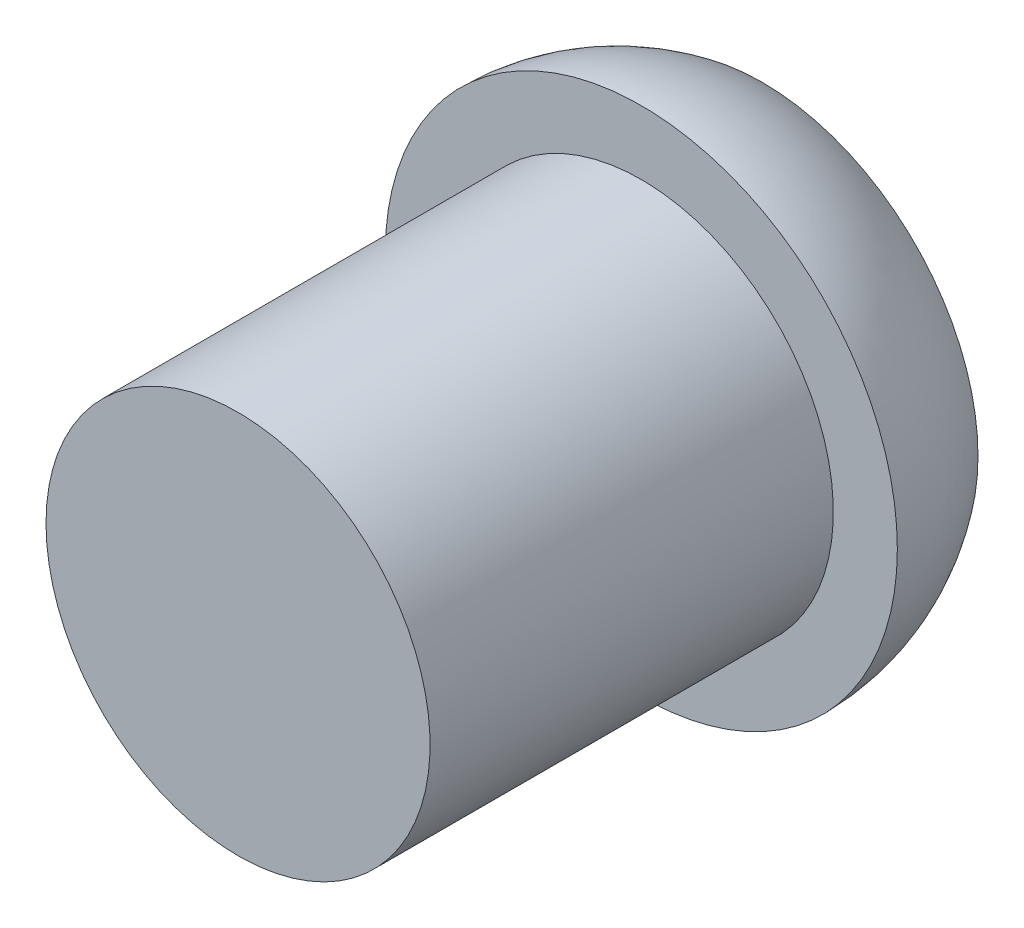
ISO-10303-21;
HEADER;
FILE_DESCRIPTION(('STEP AP214'),'2;1');
FILE_NAME('part.step','',(''),(''),'','','');
FILE_SCHEMA(('AUTOMOTIVE_DESIGN { 1 0 10303 214 1 1 1 1 }'));
ENDSEC;
DATA;
#1=APPLICATION_CONTEXT('core data for automotive mechanical design processes');
#2=APPLICATION_PROTOCOL_DEFINITION('international standard','automotive_design',2000,#1);
#3=PRODUCT_CONTEXT('',#1,'mechanical');
#4=PRODUCT('Part','Part','',(#3));
#5=PRODUCT_RELATED_PRODUCT_CATEGORY('part','',(#4));
#6=PRODUCT_DEFINITION_FORMATION('','',#4);
#7=PRODUCT_DEFINITION_CONTEXT('part definition',#1,'design');
#8=PRODUCT_DEFINITION('design','',#6,#7);
#9=PRODUCT_DEFINITION_SHAPE('','',#8);
#10=(LENGTH_UNIT() NAMED_UNIT(*) SI_UNIT(.MILLI.,.METRE.));
#11=(NAMED_UNIT(*) PLANE_ANGLE_UNIT() SI_UNIT($,.RADIAN.));
#12=(NAMED_UNIT(*) SI_UNIT($,.STERADIAN.) SOLID_ANGLE_UNIT());
#13=UNCERTAINTY_MEASURE_WITH_UNIT(LENGTH_MEASURE(1.E-05),#10,'distance_accuracy_value','');
#14=(GEOMETRIC_REPRESENTATION_CONTEXT(3) GLOBAL_UNCERTAINTY_ASSIGNED_CONTEXT((#13)) GLOBAL_UNIT_ASSIGNED_CONTEXT((#10,
#11,#12)) REPRESENTATION_CONTEXT('',''));
#15=CARTESIAN_POINT('',(0.,0.,0.));
#16=DIRECTION('',(0.,0.,1.));
#17=DIRECTION('',(1.,0.,0.));
#18=AXIS2_PLACEMENT_3D('',#15,#16,#17);
#19=CARTESIAN_POINT('',(0.,0.,10.));
#20=DIRECTION('',(0.,0.,-1.));
#21=DIRECTION('',(-1.,0.,0.));
#22=AXIS2_PLACEMENT_3D('',#19,#20,#21);
#23=PLANE('',#22);
#24=CARTESIAN_POINT('',(0.,0.,10.));
#25=DIRECTION('',(0.,0.,-1.));
#26=DIRECTION('',(-1.,0.,0.));
#27=AXIS2_PLACEMENT_3D('',#24,#25,#26);
#28=CIRCLE('',#27,4.7625);
#29=CARTESIAN_POINT('',(-4.7625,0.,10.));
#30=VERTEX_POINT('',#29);
#31=EDGE_CURVE('E10',#30,#30,#28,.T.);
#32=ORIENTED_EDGE('',*,*,#31,.F.);
#33=EDGE_LOOP('',(#32));
#34=FACE_BOUND('',#33,.T.);
#35=ADVANCED_FACE('F32',(#34),#23,.F.);
#36=CARTESIAN_POINT('',(0.,0.,-5.));
#37=DIRECTION('',(0.,0.,-1.));
#38=DIRECTION('',(-1.,0.,0.));
#39=AXIS2_PLACEMENT_3D('',#36,#37,#38);
#40=CYLINDRICAL_SURFACE('',#39,4.7625);
#41=CARTESIAN_POINT('',(0.,0.,0.));
#42=DIRECTION('',(0.,0.,-1.));
#43=DIRECTION('',(-1.,0.,0.));
#44=AXIS2_PLACEMENT_3D('',#41,#42,#43);
#45=CIRCLE('',#44,4.7625);
#46=CARTESIAN_POINT('',(-4.7625,0.,0.));
#47=VERTEX_POINT('',#46);
#48=EDGE_CURVE('E38',#47,#47,#45,.T.);
#49=ORIENTED_EDGE('',*,*,#48,.F.);
#50=EDGE_LOOP('',(#49));
#51=FACE_BOUND('',#50,.T.);
#52=ORIENTED_EDGE('',*,*,#31,.T.);
#53=EDGE_LOOP('',(#52));
#54=FACE_BOUND('',#53,.T.);
#55=ADVANCED_FACE('F71',(#51,#54),#40,.T.);
#56=CARTESIAN_POINT('',(4.7625,0.,0.));
#57=DIRECTION('',(0.,0.,-1.));
#58=DIRECTION('',(-1.,0.,0.));
#59=AXIS2_PLACEMENT_3D('',#56,#57,#58);
#60=PLANE('',#59);
#61=CARTESIAN_POINT('',(0.,0.,0.));
#62=DIRECTION('',(0.,0.,-1.));
#63=DIRECTION('',(-1.,0.,0.));
#64=AXIS2_PLACEMENT_3D('',#61,#62,#63);
#65=CIRCLE('',#64,6.35);
#66=CARTESIAN_POINT('',(-6.35,0.,0.));
#67=VERTEX_POINT('',#66);
#68=EDGE_CURVE('E42',#67,#67,#65,.T.);
#69=ORIENTED_EDGE('',*,*,#68,.F.);
#70=EDGE_LOOP('',(#69));
#71=FACE_BOUND('',#70,.T.);
#72=ORIENTED_EDGE('',*,*,#48,.T.);
#73=EDGE_LOOP('',(#72));
#74=FACE_BOUND('',#73,.T.);
#75=ADVANCED_FACE('F66',(#71,#74),#60,.F.);
#76=CARTESIAN_POINT('',(0.,0.,0.));
#77=DIRECTION('',(0.,0.,-1.));
#78=DIRECTION('',(-1.,0.,0.));
#79=AXIS2_PLACEMENT_3D('',#76,#77,#78);
#80=DEGENERATE_TOROIDAL_SURFACE('',#79,1.35,5.,.T.);
#81=CARTESIAN_POINT('',(0.,0.,-3.));
#82=DIRECTION('',(0.,0.,-1.));
#83=DIRECTION('',(-1.,0.,0.));
#84=AXIS2_PLACEMENT_3D('',#81,#82,#83);
#85=CIRCLE('',#84,5.35);
#86=CARTESIAN_POINT('',(-5.35,0.,-3.));
#87=VERTEX_POINT('',#86);
#88=EDGE_CURVE('E46',#87,#87,#85,.T.);
#89=ORIENTED_EDGE('',*,*,#88,.F.);
#90=EDGE_LOOP('',(#89));
#91=FACE_BOUND('',#90,.T.);
#92=ORIENTED_EDGE('',*,*,#68,.T.);
#93=EDGE_LOOP('',(#92));
#94=FACE_BOUND('',#93,.T.);
#95=ADVANCED_FACE('F60',(#91,#94),#80,.T.);
#96=CARTESIAN_POINT('',(5.35,0.,-3.));
#97=DIRECTION('',(0.,0.,1.));
#98=DIRECTION('',(1.,0.,0.));
#99=AXIS2_PLACEMENT_3D('',#96,#97,#98);
#100=PLANE('',#99);
#101=CARTESIAN_POINT('',(0.,0.,-3.));
#102=DIRECTION('',(0.,0.,-1.));
#103=DIRECTION('',(-1.,0.,0.));
#104=AXIS2_PLACEMENT_3D('',#101,#102,#103);
#105=CIRCLE('',#104,3.46410161513775);
#106=CARTESIAN_POINT('',(-3.46410161513775,0.,-3.));
#107=VERTEX_POINT('',#106);
#108=EDGE_CURVE('E51',#107,#107,#105,.T.);
#109=ORIENTED_EDGE('',*,*,#108,.F.);
#110=EDGE_LOOP('',(#109));
#111=FACE_BOUND('',#110,.T.);
#112=ORIENTED_EDGE('',*,*,#88,.T.);
#113=EDGE_LOOP('',(#112));
#114=FACE_BOUND('',#113,.T.);
#115=ADVANCED_FACE('F57',(#111,#114),#100,.F.);
#116=CARTESIAN_POINT('',(0.,0.,-0.999999999999999));
#117=DIRECTION('',(0.,0.,-1.));
#118=DIRECTION('',(1.,0.,0.));
#119=AXIS2_PLACEMENT_3D('',#116,#117,#118);
#120=SPHERICAL_SURFACE('',#119,4.);
#121=ORIENTED_EDGE('',*,*,#108,.T.);
#122=EDGE_LOOP('',(#121));
#123=FACE_BOUND('',#122,.T.);
#124=ADVANCED_FACE('F55',(#123),#120,.T.);
#125=CLOSED_SHELL('',(#35,#55,#75,#95,#115,#124));
#126=MANIFOLD_SOLID_BREP('B2',#125);
#127=ADVANCED_BREP_SHAPE_REPRESENTATION('',(#18,#126),#14);
#128=SHAPE_DEFINITION_REPRESENTATION(#9,#127);
ENDSEC;
END-ISO-10303-21;
